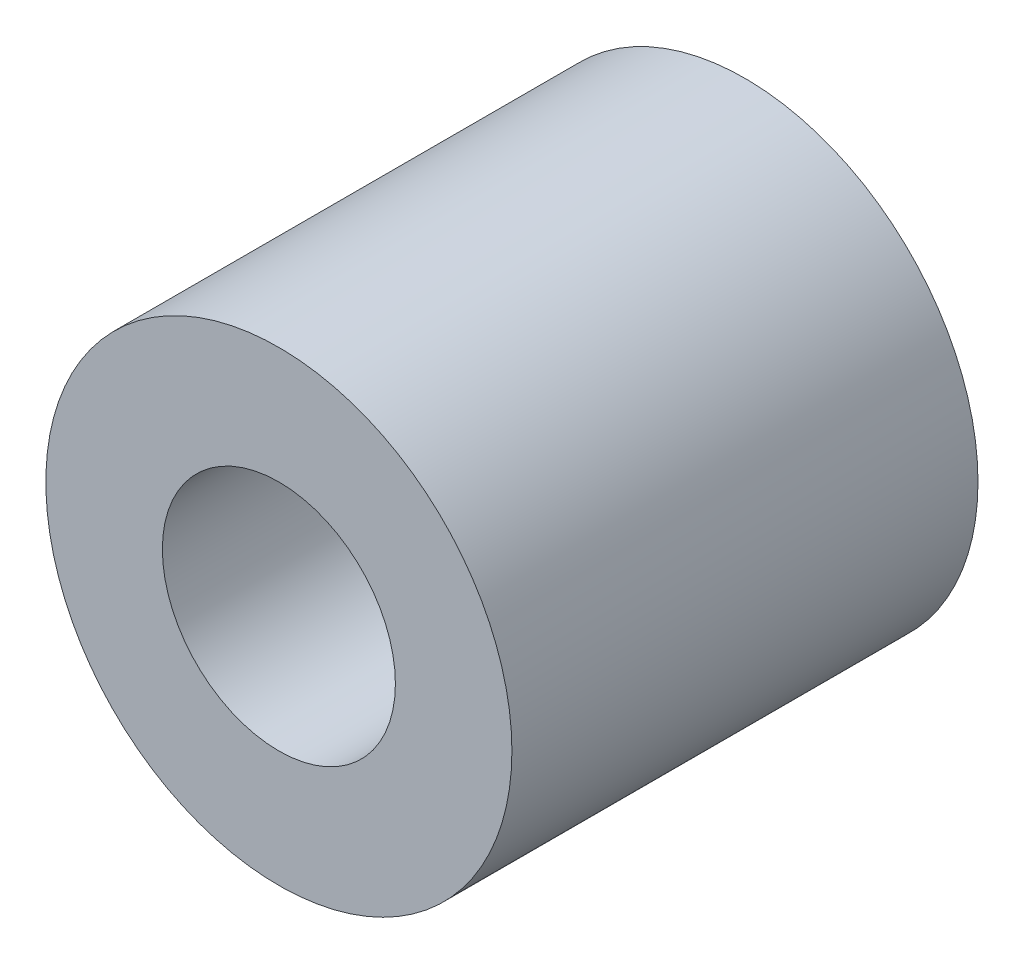
ISO-10303-21;
HEADER;
FILE_DESCRIPTION(('STEP AP214'),'2;1');
FILE_NAME('part.step','',(''),(''),'','','');
FILE_SCHEMA(('AUTOMOTIVE_DESIGN { 1 0 10303 214 1 1 1 1 }'));
ENDSEC;
DATA;
#1=APPLICATION_CONTEXT('core data for automotive mechanical design processes');
#2=APPLICATION_PROTOCOL_DEFINITION('international standard','automotive_design',2000,#1);
#3=PRODUCT_CONTEXT('',#1,'mechanical');
#4=PRODUCT('Part','Part','',(#3));
#5=PRODUCT_RELATED_PRODUCT_CATEGORY('part','',(#4));
#6=PRODUCT_DEFINITION_FORMATION('','',#4);
#7=PRODUCT_DEFINITION_CONTEXT('part definition',#1,'design');
#8=PRODUCT_DEFINITION('design','',#6,#7);
#9=PRODUCT_DEFINITION_SHAPE('','',#8);
#10=(LENGTH_UNIT() NAMED_UNIT(*) SI_UNIT(.MILLI.,.METRE.));
#11=(NAMED_UNIT(*) PLANE_ANGLE_UNIT() SI_UNIT($,.RADIAN.));
#12=(NAMED_UNIT(*) SI_UNIT($,.STERADIAN.) SOLID_ANGLE_UNIT());
#13=UNCERTAINTY_MEASURE_WITH_UNIT(LENGTH_MEASURE(1.E-05),#10,'distance_accuracy_value','');
#14=(GEOMETRIC_REPRESENTATION_CONTEXT(3) GLOBAL_UNCERTAINTY_ASSIGNED_CONTEXT((#13)) GLOBAL_UNIT_ASSIGNED_CONTEXT((#10,
#11,#12)) REPRESENTATION_CONTEXT('',''));
#15=CARTESIAN_POINT('',(0.,0.,0.));
#16=DIRECTION('',(0.,0.,1.));
#17=DIRECTION('',(1.,0.,0.));
#18=AXIS2_PLACEMENT_3D('',#15,#16,#17);
#19=CARTESIAN_POINT('',(0.,0.,8.));
#20=DIRECTION('',(0.,0.,1.));
#21=DIRECTION('',(1.,0.,0.));
#22=AXIS2_PLACEMENT_3D('',#19,#20,#21);
#23=PLANE('',#22);
#24=CARTESIAN_POINT('',(0.,0.,8.));
#25=DIRECTION('',(0.,0.,1.));
#26=DIRECTION('',(1.,0.,0.));
#27=AXIS2_PLACEMENT_3D('',#24,#25,#26);
#28=CIRCLE('',#27,4.);
#29=CARTESIAN_POINT('',(4.,0.,8.));
#30=VERTEX_POINT('',#29);
#31=EDGE_CURVE('E10',#30,#30,#28,.T.);
#32=ORIENTED_EDGE('',*,*,#31,.T.);
#33=EDGE_LOOP('',(#32));
#34=FACE_BOUND('',#33,.T.);
#35=CARTESIAN_POINT('',(0.,0.,8.));
#36=DIRECTION('',(0.,0.,1.));
#37=DIRECTION('',(1.,0.,0.));
#38=AXIS2_PLACEMENT_3D('',#35,#36,#37);
#39=CIRCLE('',#38,2.);
#40=CARTESIAN_POINT('',(2.,0.,8.));
#41=VERTEX_POINT('',#40);
#42=EDGE_CURVE('E43',#41,#41,#39,.T.);
#43=ORIENTED_EDGE('',*,*,#42,.F.);
#44=EDGE_LOOP('',(#43));
#45=FACE_BOUND('',#44,.T.);
#46=ADVANCED_FACE('F32',(#34,#45),#23,.T.);
#47=CARTESIAN_POINT('',(0.,0.,0.));
#48=DIRECTION('',(0.,0.,1.));
#49=DIRECTION('',(1.,0.,0.));
#50=AXIS2_PLACEMENT_3D('',#47,#48,#49);
#51=PLANE('',#50);
#52=CARTESIAN_POINT('',(0.,0.,0.));
#53=DIRECTION('',(0.,0.,1.));
#54=DIRECTION('',(1.,0.,0.));
#55=AXIS2_PLACEMENT_3D('',#52,#53,#54);
#56=CIRCLE('',#55,4.);
#57=CARTESIAN_POINT('',(4.,0.,0.));
#58=VERTEX_POINT('',#57);
#59=EDGE_CURVE('E36',#58,#58,#56,.T.);
#60=ORIENTED_EDGE('',*,*,#59,.F.);
#61=EDGE_LOOP('',(#60));
#62=FACE_BOUND('',#61,.T.);
#63=CARTESIAN_POINT('',(0.,0.,0.));
#64=DIRECTION('',(0.,0.,1.));
#65=DIRECTION('',(1.,0.,0.));
#66=AXIS2_PLACEMENT_3D('',#63,#64,#65);
#67=CIRCLE('',#66,2.);
#68=CARTESIAN_POINT('',(2.,0.,0.));
#69=VERTEX_POINT('',#68);
#70=EDGE_CURVE('E45',#69,#69,#67,.T.);
#71=ORIENTED_EDGE('',*,*,#70,.T.);
#72=EDGE_LOOP('',(#71));
#73=FACE_BOUND('',#72,.T.);
#74=ADVANCED_FACE('F55',(#62,#73),#51,.F.);
#75=CARTESIAN_POINT('',(0.,0.,8.));
#76=DIRECTION('',(0.,0.,-1.));
#77=DIRECTION('',(-1.,0.,0.));
#78=AXIS2_PLACEMENT_3D('',#75,#76,#77);
#79=CYLINDRICAL_SURFACE('',#78,4.);
#80=ORIENTED_EDGE('',*,*,#31,.F.);
#81=EDGE_LOOP('',(#80));
#82=FACE_BOUND('',#81,.T.);
#83=ORIENTED_EDGE('',*,*,#59,.T.);
#84=EDGE_LOOP('',(#83));
#85=FACE_BOUND('',#84,.T.);
#86=ADVANCED_FACE('F34',(#82,#85),#79,.T.);
#87=CARTESIAN_POINT('',(0.,0.,8.));
#88=DIRECTION('',(0.,0.,-1.));
#89=DIRECTION('',(-1.,0.,0.));
#90=AXIS2_PLACEMENT_3D('',#87,#88,#89);
#91=CYLINDRICAL_SURFACE('',#90,2.);
#92=ORIENTED_EDGE('',*,*,#42,.T.);
#93=EDGE_LOOP('',(#92));
#94=FACE_BOUND('',#93,.T.);
#95=ORIENTED_EDGE('',*,*,#70,.F.);
#96=EDGE_LOOP('',(#95));
#97=FACE_BOUND('',#96,.T.);
#98=ADVANCED_FACE('F51',(#94,#97),#91,.F.);
#99=CLOSED_SHELL('',(#46,#74,#86,#98));
#100=MANIFOLD_SOLID_BREP('B2',#99);
#101=ADVANCED_BREP_SHAPE_REPRESENTATION('',(#18,#100),#14);
#102=SHAPE_DEFINITION_REPRESENTATION(#9,#101);
ENDSEC;
END-ISO-10303-21;
